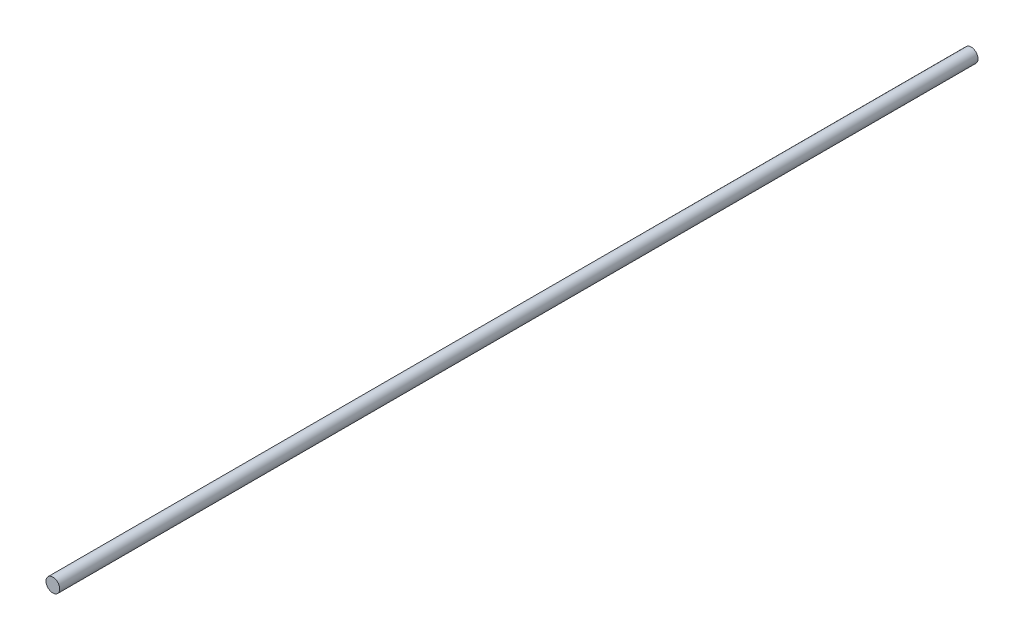
ISO-10303-21;
HEADER;
FILE_DESCRIPTION(('STEP AP214'),'2;1');
FILE_NAME('part.step','',(''),(''),'','','');
FILE_SCHEMA(('AUTOMOTIVE_DESIGN { 1 0 10303 214 1 1 1 1 }'));
ENDSEC;
DATA;
#1=APPLICATION_CONTEXT('core data for automotive mechanical design processes');
#2=APPLICATION_PROTOCOL_DEFINITION('international standard','automotive_design',2000,#1);
#3=PRODUCT_CONTEXT('',#1,'mechanical');
#4=PRODUCT('Part','Part','',(#3));
#5=PRODUCT_RELATED_PRODUCT_CATEGORY('part','',(#4));
#6=PRODUCT_DEFINITION_FORMATION('','',#4);
#7=PRODUCT_DEFINITION_CONTEXT('part definition',#1,'design');
#8=PRODUCT_DEFINITION('design','',#6,#7);
#9=PRODUCT_DEFINITION_SHAPE('','',#8);
#10=(LENGTH_UNIT() NAMED_UNIT(*) SI_UNIT(.MILLI.,.METRE.));
#11=(NAMED_UNIT(*) PLANE_ANGLE_UNIT() SI_UNIT($,.RADIAN.));
#12=(NAMED_UNIT(*) SI_UNIT($,.STERADIAN.) SOLID_ANGLE_UNIT());
#13=UNCERTAINTY_MEASURE_WITH_UNIT(LENGTH_MEASURE(1.E-05),#10,'distance_accuracy_value','');
#14=(GEOMETRIC_REPRESENTATION_CONTEXT(3) GLOBAL_UNCERTAINTY_ASSIGNED_CONTEXT((#13)) GLOBAL_UNIT_ASSIGNED_CONTEXT((#10,
#11,#12)) REPRESENTATION_CONTEXT('',''));
#15=CARTESIAN_POINT('',(0.,0.,0.));
#16=DIRECTION('',(0.,0.,1.));
#17=DIRECTION('',(1.,0.,0.));
#18=AXIS2_PLACEMENT_3D('',#15,#16,#17);
#19=CARTESIAN_POINT('',(0.,0.,1000.));
#20=DIRECTION('',(0.,0.,-1.));
#21=DIRECTION('',(-1.,0.,0.));
#22=AXIS2_PLACEMENT_3D('',#19,#20,#21);
#23=CYLINDRICAL_SURFACE('',#22,7.5);
#24=CARTESIAN_POINT('',(0.,0.,1000.));
#25=DIRECTION('',(0.,0.,1.));
#26=DIRECTION('',(1.,0.,0.));
#27=AXIS2_PLACEMENT_3D('',#24,#25,#26);
#28=CIRCLE('',#27,7.5);
#29=CARTESIAN_POINT('',(7.5,0.,1000.));
#30=VERTEX_POINT('',#29);
#31=EDGE_CURVE('E10',#30,#30,#28,.T.);
#32=ORIENTED_EDGE('',*,*,#31,.F.);
#33=EDGE_LOOP('',(#32));
#34=FACE_BOUND('',#33,.T.);
#35=CARTESIAN_POINT('',(0.,0.,0.));
#36=DIRECTION('',(0.,0.,1.));
#37=DIRECTION('',(1.,0.,0.));
#38=AXIS2_PLACEMENT_3D('',#35,#36,#37);
#39=CIRCLE('',#38,7.5);
#40=CARTESIAN_POINT('',(7.5,0.,0.));
#41=VERTEX_POINT('',#40);
#42=EDGE_CURVE('E40',#41,#41,#39,.T.);
#43=ORIENTED_EDGE('',*,*,#42,.T.);
#44=EDGE_LOOP('',(#43));
#45=FACE_BOUND('',#44,.T.);
#46=ADVANCED_FACE('F37',(#34,#45),#23,.T.);
#47=CARTESIAN_POINT('',(0.,0.,1000.));
#48=DIRECTION('',(0.,0.,1.));
#49=DIRECTION('',(1.,0.,0.));
#50=AXIS2_PLACEMENT_3D('',#47,#48,#49);
#51=PLANE('',#50);
#52=ORIENTED_EDGE('',*,*,#31,.T.);
#53=EDGE_LOOP('',(#52));
#54=FACE_BOUND('',#53,.T.);
#55=ADVANCED_FACE('F54',(#54),#51,.T.);
#56=CARTESIAN_POINT('',(0.,0.,0.));
#57=DIRECTION('',(0.,0.,1.));
#58=DIRECTION('',(1.,0.,0.));
#59=AXIS2_PLACEMENT_3D('',#56,#57,#58);
#60=PLANE('',#59);
#61=ORIENTED_EDGE('',*,*,#42,.F.);
#62=EDGE_LOOP('',(#61));
#63=FACE_BOUND('',#62,.T.);
#64=ADVANCED_FACE('F52',(#63),#60,.F.);
#65=CLOSED_SHELL('',(#46,#55,#64));
#66=MANIFOLD_SOLID_BREP('B2',#65);
#67=ADVANCED_BREP_SHAPE_REPRESENTATION('',(#18,#66),#14);
#68=SHAPE_DEFINITION_REPRESENTATION(#9,#67);
ENDSEC;
END-ISO-10303-21;
